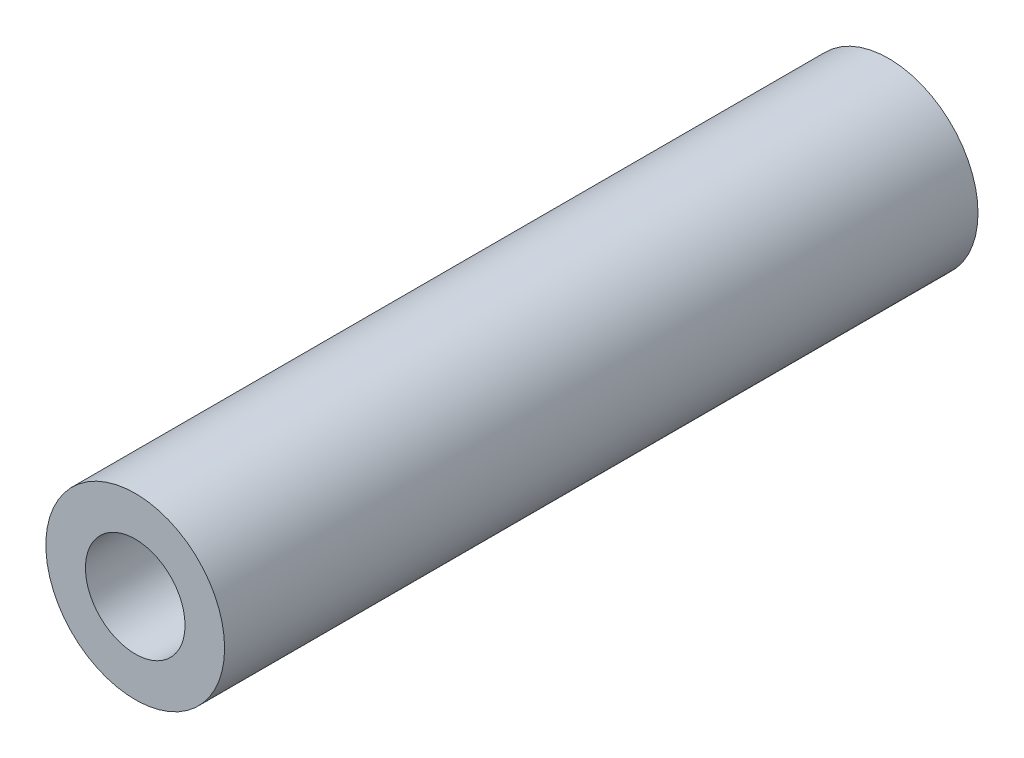
ISO-10303-21;
HEADER;
FILE_DESCRIPTION(('STEP AP214'),'2;1');
FILE_NAME('part.step','',(''),(''),'','','');
FILE_SCHEMA(('AUTOMOTIVE_DESIGN { 1 0 10303 214 1 1 1 1 }'));
ENDSEC;
DATA;
#1=APPLICATION_CONTEXT('core data for automotive mechanical design processes');
#2=APPLICATION_PROTOCOL_DEFINITION('international standard','automotive_design',2000,#1);
#3=PRODUCT_CONTEXT('',#1,'mechanical');
#4=PRODUCT('Part','Part','',(#3));
#5=PRODUCT_RELATED_PRODUCT_CATEGORY('part','',(#4));
#6=PRODUCT_DEFINITION_FORMATION('','',#4);
#7=PRODUCT_DEFINITION_CONTEXT('part definition',#1,'design');
#8=PRODUCT_DEFINITION('design','',#6,#7);
#9=PRODUCT_DEFINITION_SHAPE('','',#8);
#10=(LENGTH_UNIT() NAMED_UNIT(*) SI_UNIT(.MILLI.,.METRE.));
#11=(NAMED_UNIT(*) PLANE_ANGLE_UNIT() SI_UNIT($,.RADIAN.));
#12=(NAMED_UNIT(*) SI_UNIT($,.STERADIAN.) SOLID_ANGLE_UNIT());
#13=UNCERTAINTY_MEASURE_WITH_UNIT(LENGTH_MEASURE(1.E-05),#10,'distance_accuracy_value','');
#14=(GEOMETRIC_REPRESENTATION_CONTEXT(3) GLOBAL_UNCERTAINTY_ASSIGNED_CONTEXT((#13)) GLOBAL_UNIT_ASSIGNED_CONTEXT((#10,
#11,#12)) REPRESENTATION_CONTEXT('',''));
#15=CARTESIAN_POINT('',(0.,0.,0.));
#16=DIRECTION('',(0.,0.,1.));
#17=DIRECTION('',(1.,0.,0.));
#18=AXIS2_PLACEMENT_3D('',#15,#16,#17);
#19=CARTESIAN_POINT('',(0.,0.,29.5));
#20=DIRECTION('',(0.,0.,-1.));
#21=DIRECTION('',(-1.,0.,0.));
#22=AXIS2_PLACEMENT_3D('',#19,#20,#21);
#23=CYLINDRICAL_SURFACE('',#22,3.5);
#24=CARTESIAN_POINT('',(0.,0.,29.5));
#25=DIRECTION('',(0.,0.,1.));
#26=DIRECTION('',(1.,0.,0.));
#27=AXIS2_PLACEMENT_3D('',#24,#25,#26);
#28=CIRCLE('',#27,3.5);
#29=CARTESIAN_POINT('',(3.5,0.,29.5));
#30=VERTEX_POINT('',#29);
#31=EDGE_CURVE('E10',#30,#30,#28,.T.);
#32=ORIENTED_EDGE('',*,*,#31,.F.);
#33=EDGE_LOOP('',(#32));
#34=FACE_BOUND('',#33,.T.);
#35=CARTESIAN_POINT('',(0.,0.,0.));
#36=DIRECTION('',(0.,0.,1.));
#37=DIRECTION('',(1.,0.,0.));
#38=AXIS2_PLACEMENT_3D('',#35,#36,#37);
#39=CIRCLE('',#38,3.5);
#40=CARTESIAN_POINT('',(3.5,0.,0.));
#41=VERTEX_POINT('',#40);
#42=EDGE_CURVE('E36',#41,#41,#39,.T.);
#43=ORIENTED_EDGE('',*,*,#42,.T.);
#44=EDGE_LOOP('',(#43));
#45=FACE_BOUND('',#44,.T.);
#46=ADVANCED_FACE('F33',(#34,#45),#23,.T.);
#47=CARTESIAN_POINT('',(0.,0.,29.5));
#48=DIRECTION('',(0.,0.,1.));
#49=DIRECTION('',(1.,0.,0.));
#50=AXIS2_PLACEMENT_3D('',#47,#48,#49);
#51=PLANE('',#50);
#52=CARTESIAN_POINT('',(0.,0.,29.5));
#53=DIRECTION('',(0.,0.,1.));
#54=DIRECTION('',(1.,0.,0.));
#55=AXIS2_PLACEMENT_3D('',#52,#53,#54);
#56=CIRCLE('',#55,1.95);
#57=CARTESIAN_POINT('',(1.95,0.,29.5));
#58=VERTEX_POINT('',#57);
#59=EDGE_CURVE('E47',#58,#58,#56,.T.);
#60=ORIENTED_EDGE('',*,*,#59,.F.);
#61=EDGE_LOOP('',(#60));
#62=FACE_BOUND('',#61,.T.);
#63=ORIENTED_EDGE('',*,*,#31,.T.);
#64=EDGE_LOOP('',(#63));
#65=FACE_BOUND('',#64,.T.);
#66=ADVANCED_FACE('F53',(#62,#65),#51,.T.);
#67=CARTESIAN_POINT('',(0.,0.,0.));
#68=DIRECTION('',(0.,0.,1.));
#69=DIRECTION('',(1.,0.,0.));
#70=AXIS2_PLACEMENT_3D('',#67,#68,#69);
#71=PLANE('',#70);
#72=CARTESIAN_POINT('',(0.,0.,0.));
#73=DIRECTION('',(0.,0.,1.));
#74=DIRECTION('',(1.,0.,0.));
#75=AXIS2_PLACEMENT_3D('',#72,#73,#74);
#76=CIRCLE('',#75,1.94999999999999);
#77=CARTESIAN_POINT('',(1.94999999999999,0.,0.));
#78=VERTEX_POINT('',#77);
#79=EDGE_CURVE('E43',#78,#78,#76,.T.);
#80=ORIENTED_EDGE('',*,*,#79,.T.);
#81=EDGE_LOOP('',(#80));
#82=FACE_BOUND('',#81,.T.);
#83=ORIENTED_EDGE('',*,*,#42,.F.);
#84=EDGE_LOOP('',(#83));
#85=FACE_BOUND('',#84,.T.);
#86=ADVANCED_FACE('F55',(#82,#85),#71,.F.);
#87=CARTESIAN_POINT('',(0.,0.,29.5));
#88=DIRECTION('',(0.,0.,1.));
#89=DIRECTION('',(1.,0.,0.));
#90=AXIS2_PLACEMENT_3D('',#87,#88,#89);
#91=CYLINDRICAL_SURFACE('',#90,1.94999999999999);
#92=ORIENTED_EDGE('',*,*,#79,.F.);
#93=EDGE_LOOP('',(#92));
#94=FACE_BOUND('',#93,.T.);
#95=ORIENTED_EDGE('',*,*,#59,.T.);
#96=EDGE_LOOP('',(#95));
#97=FACE_BOUND('',#96,.T.);
#98=ADVANCED_FACE('F51',(#94,#97),#91,.F.);
#99=CLOSED_SHELL('',(#46,#66,#86,#98));
#100=MANIFOLD_SOLID_BREP('B2',#99);
#101=ADVANCED_BREP_SHAPE_REPRESENTATION('',(#18,#100),#14);
#102=SHAPE_DEFINITION_REPRESENTATION(#9,#101);
ENDSEC;
END-ISO-10303-21;
